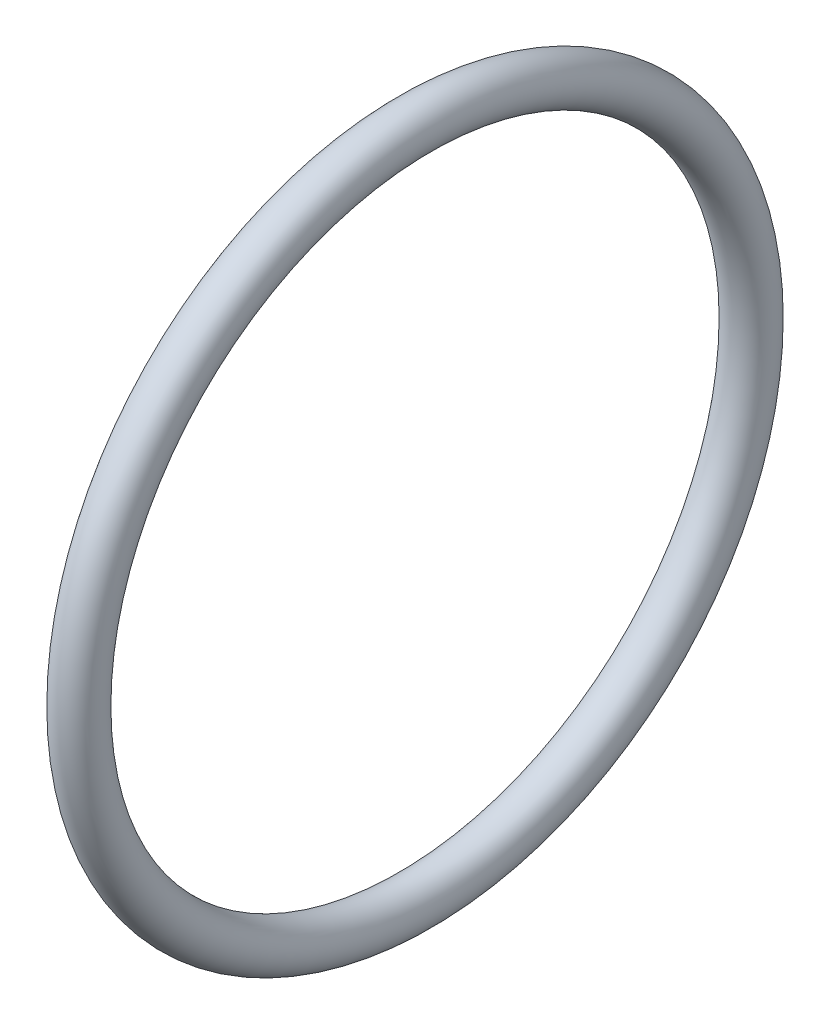
ISO-10303-21;
HEADER;
FILE_DESCRIPTION(('STEP AP214'),'2;1');
FILE_NAME('part.step','',(''),(''),'','','');
FILE_SCHEMA(('AUTOMOTIVE_DESIGN { 1 0 10303 214 1 1 1 1 }'));
ENDSEC;
DATA;
#1=APPLICATION_CONTEXT('core data for automotive mechanical design processes');
#2=APPLICATION_PROTOCOL_DEFINITION('international standard','automotive_design',2000,#1);
#3=PRODUCT_CONTEXT('',#1,'mechanical');
#4=PRODUCT('Part','Part','',(#3));
#5=PRODUCT_RELATED_PRODUCT_CATEGORY('part','',(#4));
#6=PRODUCT_DEFINITION_FORMATION('','',#4);
#7=PRODUCT_DEFINITION_CONTEXT('part definition',#1,'design');
#8=PRODUCT_DEFINITION('design','',#6,#7);
#9=PRODUCT_DEFINITION_SHAPE('','',#8);
#10=(LENGTH_UNIT() NAMED_UNIT(*) SI_UNIT(.MILLI.,.METRE.));
#11=(NAMED_UNIT(*) PLANE_ANGLE_UNIT() SI_UNIT($,.RADIAN.));
#12=(NAMED_UNIT(*) SI_UNIT($,.STERADIAN.) SOLID_ANGLE_UNIT());
#13=UNCERTAINTY_MEASURE_WITH_UNIT(LENGTH_MEASURE(1.E-05),#10,'distance_accuracy_value','');
#14=(GEOMETRIC_REPRESENTATION_CONTEXT(3) GLOBAL_UNCERTAINTY_ASSIGNED_CONTEXT((#13)) GLOBAL_UNIT_ASSIGNED_CONTEXT((#10,
#11,#12)) REPRESENTATION_CONTEXT('',''));
#15=CARTESIAN_POINT('',(0.,0.,0.));
#16=DIRECTION('',(0.,0.,1.));
#17=DIRECTION('',(1.,0.,0.));
#18=AXIS2_PLACEMENT_3D('',#15,#16,#17);
#19=CARTESIAN_POINT('',(0.,0.,0.));
#20=DIRECTION('',(1.,0.,0.));
#21=DIRECTION('',(0.,0.,-1.));
#22=AXIS2_PLACEMENT_3D('',#19,#20,#21);
#23=TOROIDAL_SURFACE('',#22,19.3929,1.3081);
#24=CARTESIAN_POINT('',(0.,0.,-20.701));
#25=VERTEX_POINT('',#24);
#26=VERTEX_LOOP('',#25);
#27=FACE_BOUND('',#26,.T.);
#28=ADVANCED_FACE('F33',(#27),#23,.T.);
#29=CLOSED_SHELL('',(#28));
#30=MANIFOLD_SOLID_BREP('B2',#29);
#31=ADVANCED_BREP_SHAPE_REPRESENTATION('',(#18,#30),#14);
#32=SHAPE_DEFINITION_REPRESENTATION(#9,#31);
ENDSEC;
END-ISO-10303-21;
